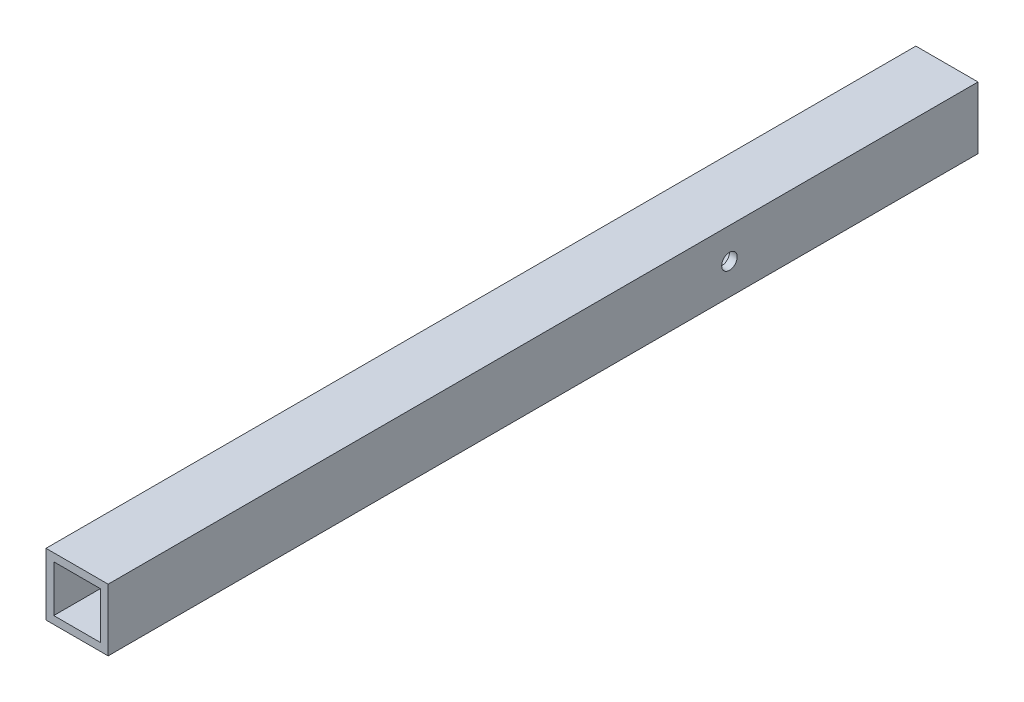
ISO-10303-21;
HEADER;
FILE_DESCRIPTION(('STEP AP214'),'2;1');
FILE_NAME('part.step','',(''),(''),'','','');
FILE_SCHEMA(('AUTOMOTIVE_DESIGN { 1 0 10303 214 1 1 1 1 }'));
ENDSEC;
DATA;
#1=APPLICATION_CONTEXT('core data for automotive mechanical design processes');
#2=APPLICATION_PROTOCOL_DEFINITION('international standard','automotive_design',2000,#1);
#3=PRODUCT_CONTEXT('',#1,'mechanical');
#4=PRODUCT('Part','Part','',(#3));
#5=PRODUCT_RELATED_PRODUCT_CATEGORY('part','',(#4));
#6=PRODUCT_DEFINITION_FORMATION('','',#4);
#7=PRODUCT_DEFINITION_CONTEXT('part definition',#1,'design');
#8=PRODUCT_DEFINITION('design','',#6,#7);
#9=PRODUCT_DEFINITION_SHAPE('','',#8);
#10=(LENGTH_UNIT() NAMED_UNIT(*) SI_UNIT(.MILLI.,.METRE.));
#11=(NAMED_UNIT(*) PLANE_ANGLE_UNIT() SI_UNIT($,.RADIAN.));
#12=(NAMED_UNIT(*) SI_UNIT($,.STERADIAN.) SOLID_ANGLE_UNIT());
#13=UNCERTAINTY_MEASURE_WITH_UNIT(LENGTH_MEASURE(1.E-05),#10,'distance_accuracy_value','');
#14=(GEOMETRIC_REPRESENTATION_CONTEXT(3) GLOBAL_UNCERTAINTY_ASSIGNED_CONTEXT((#13)) GLOBAL_UNIT_ASSIGNED_CONTEXT((#10,
#11,#12)) REPRESENTATION_CONTEXT('',''));
#15=CARTESIAN_POINT('',(0.,0.,0.));
#16=DIRECTION('',(0.,0.,1.));
#17=DIRECTION('',(1.,0.,0.));
#18=AXIS2_PLACEMENT_3D('',#15,#16,#17);
#19=CARTESIAN_POINT('',(0.,0.,355.6));
#20=DIRECTION('',(0.,0.,-1.));
#21=DIRECTION('',(-1.,0.,0.));
#22=AXIS2_PLACEMENT_3D('',#19,#20,#21);
#23=PLANE('',#22);
#24=DIRECTION('',(0.,-1.,0.));
#25=VECTOR('',#24,1.);
#26=CARTESIAN_POINT('',(0.,0.,355.6));
#27=LINE('',#26,#25);
#28=CARTESIAN_POINT('',(0.,25.4,355.6));
#29=VERTEX_POINT('',#28);
#30=CARTESIAN_POINT('',(0.,0.,355.6));
#31=VERTEX_POINT('',#30);
#32=EDGE_CURVE('E156',#29,#31,#27,.T.);
#33=ORIENTED_EDGE('',*,*,#32,.T.);
#34=DIRECTION('',(1.,0.,0.));
#35=VECTOR('',#34,1.);
#36=CARTESIAN_POINT('',(0.,0.,355.6));
#37=LINE('',#36,#35);
#38=CARTESIAN_POINT('',(25.4,0.,355.6));
#39=VERTEX_POINT('',#38);
#40=EDGE_CURVE('E160',#31,#39,#37,.T.);
#41=ORIENTED_EDGE('',*,*,#40,.T.);
#42=DIRECTION('',(0.,1.,0.));
#43=VECTOR('',#42,1.);
#44=CARTESIAN_POINT('',(25.4,0.,355.6));
#45=LINE('',#44,#43);
#46=CARTESIAN_POINT('',(25.4,25.4,355.6));
#47=VERTEX_POINT('',#46);
#48=EDGE_CURVE('E164',#39,#47,#45,.T.);
#49=ORIENTED_EDGE('',*,*,#48,.T.);
#50=DIRECTION('',(-1.,0.,0.));
#51=VECTOR('',#50,1.);
#52=CARTESIAN_POINT('',(0.,25.4,355.6));
#53=LINE('',#52,#51);
#54=EDGE_CURVE('E167',#47,#29,#53,.T.);
#55=ORIENTED_EDGE('',*,*,#54,.T.);
#56=EDGE_LOOP('',(#33,#41,#49,#55));
#57=FACE_BOUND('',#56,.T.);
#58=DIRECTION('',(0.,1.,0.));
#59=VECTOR('',#58,1.);
#60=CARTESIAN_POINT('',(22.225,22.225,355.6));
#61=LINE('',#60,#59);
#62=CARTESIAN_POINT('',(22.225,3.175,355.6));
#63=VERTEX_POINT('',#62);
#64=CARTESIAN_POINT('',(22.225,22.225,355.6));
#65=VERTEX_POINT('',#64);
#66=EDGE_CURVE('E106',#63,#65,#61,.T.);
#67=ORIENTED_EDGE('',*,*,#66,.F.);
#68=DIRECTION('',(1.,0.,0.));
#69=VECTOR('',#68,1.);
#70=CARTESIAN_POINT('',(22.225,3.175,355.6));
#71=LINE('',#70,#69);
#72=CARTESIAN_POINT('',(3.17500000000001,3.175,355.6));
#73=VERTEX_POINT('',#72);
#74=EDGE_CURVE('E132',#73,#63,#71,.T.);
#75=ORIENTED_EDGE('',*,*,#74,.F.);
#76=DIRECTION('',(0.,-1.,0.));
#77=VECTOR('',#76,1.);
#78=CARTESIAN_POINT('',(3.175,22.225,355.6));
#79=LINE('',#78,#77);
#80=CARTESIAN_POINT('',(3.175,22.225,355.6));
#81=VERTEX_POINT('',#80);
#82=EDGE_CURVE('E128',#81,#73,#79,.T.);
#83=ORIENTED_EDGE('',*,*,#82,.F.);
#84=DIRECTION('',(-1.,0.,0.));
#85=VECTOR('',#84,1.);
#86=CARTESIAN_POINT('',(22.225,22.225,355.6));
#87=LINE('',#86,#85);
#88=EDGE_CURVE('E115',#65,#81,#87,.T.);
#89=ORIENTED_EDGE('',*,*,#88,.F.);
#90=EDGE_LOOP('',(#67,#75,#83,#89));
#91=FACE_BOUND('',#90,.T.);
#92=ADVANCED_FACE('F39',(#57,#91),#23,.F.);
#93=CARTESIAN_POINT('',(0.,0.,0.));
#94=DIRECTION('',(0.,0.,-1.));
#95=DIRECTION('',(-1.,0.,0.));
#96=AXIS2_PLACEMENT_3D('',#93,#94,#95);
#97=PLANE('',#96);
#98=DIRECTION('',(0.,-1.,0.));
#99=VECTOR('',#98,1.);
#100=CARTESIAN_POINT('',(0.,0.,0.));
#101=LINE('',#100,#99);
#102=CARTESIAN_POINT('',(0.,25.4,0.));
#103=VERTEX_POINT('',#102);
#104=CARTESIAN_POINT('',(0.,0.,0.));
#105=VERTEX_POINT('',#104);
#106=EDGE_CURVE('E124',#103,#105,#101,.T.);
#107=ORIENTED_EDGE('',*,*,#106,.F.);
#108=DIRECTION('',(-1.,0.,0.));
#109=VECTOR('',#108,1.);
#110=CARTESIAN_POINT('',(0.,25.4,0.));
#111=LINE('',#110,#109);
#112=CARTESIAN_POINT('',(25.4,25.4,0.));
#113=VERTEX_POINT('',#112);
#114=EDGE_CURVE('E161',#113,#103,#111,.T.);
#115=ORIENTED_EDGE('',*,*,#114,.F.);
#116=DIRECTION('',(0.,1.,0.));
#117=VECTOR('',#116,1.);
#118=CARTESIAN_POINT('',(25.4,0.,0.));
#119=LINE('',#118,#117);
#120=CARTESIAN_POINT('',(25.4,0.,0.));
#121=VERTEX_POINT('',#120);
#122=EDGE_CURVE('E177',#121,#113,#119,.T.);
#123=ORIENTED_EDGE('',*,*,#122,.F.);
#124=DIRECTION('',(1.,0.,0.));
#125=VECTOR('',#124,1.);
#126=CARTESIAN_POINT('',(0.,0.,0.));
#127=LINE('',#126,#125);
#128=EDGE_CURVE('E174',#105,#121,#127,.T.);
#129=ORIENTED_EDGE('',*,*,#128,.F.);
#130=EDGE_LOOP('',(#107,#115,#123,#129));
#131=FACE_BOUND('',#130,.T.);
#132=DIRECTION('',(1.,0.,0.));
#133=VECTOR('',#132,1.);
#134=CARTESIAN_POINT('',(22.225,3.175,0.));
#135=LINE('',#134,#133);
#136=CARTESIAN_POINT('',(3.17500000000001,3.175,0.));
#137=VERTEX_POINT('',#136);
#138=CARTESIAN_POINT('',(22.225,3.175,0.));
#139=VERTEX_POINT('',#138);
#140=EDGE_CURVE('E116',#137,#139,#135,.T.);
#141=ORIENTED_EDGE('',*,*,#140,.T.);
#142=DIRECTION('',(0.,1.,0.));
#143=VECTOR('',#142,1.);
#144=CARTESIAN_POINT('',(22.225,22.225,0.));
#145=LINE('',#144,#143);
#146=CARTESIAN_POINT('',(22.225,22.225,0.));
#147=VERTEX_POINT('',#146);
#148=EDGE_CURVE('E64',#139,#147,#145,.T.);
#149=ORIENTED_EDGE('',*,*,#148,.T.);
#150=DIRECTION('',(-1.,0.,0.));
#151=VECTOR('',#150,1.);
#152=CARTESIAN_POINT('',(22.225,22.225,0.));
#153=LINE('',#152,#151);
#154=CARTESIAN_POINT('',(3.175,22.225,0.));
#155=VERTEX_POINT('',#154);
#156=EDGE_CURVE('E122',#147,#155,#153,.T.);
#157=ORIENTED_EDGE('',*,*,#156,.T.);
#158=DIRECTION('',(0.,-1.,0.));
#159=VECTOR('',#158,1.);
#160=CARTESIAN_POINT('',(3.175,22.225,0.));
#161=LINE('',#160,#159);
#162=EDGE_CURVE('E143',#155,#137,#161,.T.);
#163=ORIENTED_EDGE('',*,*,#162,.T.);
#164=EDGE_LOOP('',(#141,#149,#157,#163));
#165=FACE_BOUND('',#164,.T.);
#166=ADVANCED_FACE('F201',(#131,#165),#97,.T.);
#167=CARTESIAN_POINT('',(0.,0.,355.6));
#168=DIRECTION('',(1.,0.,0.));
#169=DIRECTION('',(0.,1.,0.));
#170=AXIS2_PLACEMENT_3D('',#167,#168,#169);
#171=PLANE('',#170);
#172=CARTESIAN_POINT('',(0.,12.7,101.6));
#173=DIRECTION('',(-1.,0.,0.));
#174=DIRECTION('',(0.,-1.,0.));
#175=AXIS2_PLACEMENT_3D('',#172,#173,#174);
#176=CIRCLE('',#175,3.175);
#177=CARTESIAN_POINT('',(0.,9.525,101.6));
#178=VERTEX_POINT('',#177);
#179=EDGE_CURVE('E246',#178,#178,#176,.T.);
#180=ORIENTED_EDGE('',*,*,#179,.F.);
#181=EDGE_LOOP('',(#180));
#182=FACE_BOUND('',#181,.T.);
#183=ORIENTED_EDGE('',*,*,#106,.T.);
#184=DIRECTION('',(0.,0.,-1.));
#185=VECTOR('',#184,1.);
#186=CARTESIAN_POINT('',(0.,0.,355.6));
#187=LINE('',#186,#185);
#188=EDGE_CURVE('E11',#31,#105,#187,.T.);
#189=ORIENTED_EDGE('',*,*,#188,.F.);
#190=ORIENTED_EDGE('',*,*,#32,.F.);
#191=DIRECTION('',(0.,0.,-1.));
#192=VECTOR('',#191,1.);
#193=CARTESIAN_POINT('',(0.,25.4,355.6));
#194=LINE('',#193,#192);
#195=EDGE_CURVE('E170',#29,#103,#194,.T.);
#196=ORIENTED_EDGE('',*,*,#195,.T.);
#197=EDGE_LOOP('',(#183,#189,#190,#196));
#198=FACE_BOUND('',#197,.T.);
#199=ADVANCED_FACE('F41',(#182,#198),#171,.F.);
#200=CARTESIAN_POINT('',(0.,0.,355.6));
#201=DIRECTION('',(0.,1.,0.));
#202=DIRECTION('',(0.,0.,1.));
#203=AXIS2_PLACEMENT_3D('',#200,#201,#202);
#204=PLANE('',#203);
#205=ORIENTED_EDGE('',*,*,#128,.T.);
#206=DIRECTION('',(0.,0.,-1.));
#207=VECTOR('',#206,1.);
#208=CARTESIAN_POINT('',(25.4,0.,355.6));
#209=LINE('',#208,#207);
#210=EDGE_CURVE('E49',#39,#121,#209,.T.);
#211=ORIENTED_EDGE('',*,*,#210,.F.);
#212=ORIENTED_EDGE('',*,*,#40,.F.);
#213=ORIENTED_EDGE('',*,*,#188,.T.);
#214=EDGE_LOOP('',(#205,#211,#212,#213));
#215=FACE_BOUND('',#214,.T.);
#216=ADVANCED_FACE('F211',(#215),#204,.F.);
#217=CARTESIAN_POINT('',(25.4,0.,355.6));
#218=DIRECTION('',(-1.,0.,0.));
#219=DIRECTION('',(0.,-1.,0.));
#220=AXIS2_PLACEMENT_3D('',#217,#218,#219);
#221=PLANE('',#220);
#222=CARTESIAN_POINT('',(25.4,12.7,101.6));
#223=DIRECTION('',(-1.,0.,0.));
#224=DIRECTION('',(0.,-1.,0.));
#225=AXIS2_PLACEMENT_3D('',#222,#223,#224);
#226=CIRCLE('',#225,3.175);
#227=CARTESIAN_POINT('',(25.4,9.52500000000001,101.6));
#228=VERTEX_POINT('',#227);
#229=EDGE_CURVE('E244',#228,#228,#226,.T.);
#230=ORIENTED_EDGE('',*,*,#229,.T.);
#231=EDGE_LOOP('',(#230));
#232=FACE_BOUND('',#231,.T.);
#233=ORIENTED_EDGE('',*,*,#122,.T.);
#234=DIRECTION('',(0.,0.,-1.));
#235=VECTOR('',#234,1.);
#236=CARTESIAN_POINT('',(25.4,25.4,355.6));
#237=LINE('',#236,#235);
#238=EDGE_CURVE('E185',#47,#113,#237,.T.);
#239=ORIENTED_EDGE('',*,*,#238,.F.);
#240=ORIENTED_EDGE('',*,*,#48,.F.);
#241=ORIENTED_EDGE('',*,*,#210,.T.);
#242=EDGE_LOOP('',(#233,#239,#240,#241));
#243=FACE_BOUND('',#242,.T.);
#244=ADVANCED_FACE('F195',(#232,#243),#221,.F.);
#245=CARTESIAN_POINT('',(0.,25.4,355.6));
#246=DIRECTION('',(0.,-1.,0.));
#247=DIRECTION('',(0.,0.,-1.));
#248=AXIS2_PLACEMENT_3D('',#245,#246,#247);
#249=PLANE('',#248);
#250=ORIENTED_EDGE('',*,*,#114,.T.);
#251=ORIENTED_EDGE('',*,*,#195,.F.);
#252=ORIENTED_EDGE('',*,*,#54,.F.);
#253=ORIENTED_EDGE('',*,*,#238,.T.);
#254=EDGE_LOOP('',(#250,#251,#252,#253));
#255=FACE_BOUND('',#254,.T.);
#256=ADVANCED_FACE('F205',(#255),#249,.F.);
#257=CARTESIAN_POINT('',(22.225,22.225,355.6));
#258=DIRECTION('',(-1.,0.,0.));
#259=DIRECTION('',(0.,-1.,0.));
#260=AXIS2_PLACEMENT_3D('',#257,#258,#259);
#261=PLANE('',#260);
#262=CARTESIAN_POINT('',(22.225,12.7,101.6));
#263=DIRECTION('',(-1.,0.,0.));
#264=DIRECTION('',(0.,-1.,0.));
#265=AXIS2_PLACEMENT_3D('',#262,#263,#264);
#266=CIRCLE('',#265,3.175);
#267=CARTESIAN_POINT('',(22.225,9.52500000000001,101.6));
#268=VERTEX_POINT('',#267);
#269=EDGE_CURVE('E140',#268,#268,#266,.T.);
#270=ORIENTED_EDGE('',*,*,#269,.F.);
#271=EDGE_LOOP('',(#270));
#272=FACE_BOUND('',#271,.T.);
#273=ORIENTED_EDGE('',*,*,#148,.F.);
#274=DIRECTION('',(0.,0.,-1.));
#275=VECTOR('',#274,1.);
#276=CARTESIAN_POINT('',(22.225,3.175,355.6));
#277=LINE('',#276,#275);
#278=EDGE_CURVE('E110',#63,#139,#277,.T.);
#279=ORIENTED_EDGE('',*,*,#278,.F.);
#280=ORIENTED_EDGE('',*,*,#66,.T.);
#281=DIRECTION('',(0.,0.,-1.));
#282=VECTOR('',#281,1.);
#283=CARTESIAN_POINT('',(22.225,22.225,355.6));
#284=LINE('',#283,#282);
#285=EDGE_CURVE('E109',#65,#147,#284,.T.);
#286=ORIENTED_EDGE('',*,*,#285,.T.);
#287=EDGE_LOOP('',(#273,#279,#280,#286));
#288=FACE_BOUND('',#287,.T.);
#289=ADVANCED_FACE('F108',(#272,#288),#261,.T.);
#290=CARTESIAN_POINT('',(22.225,22.225,355.6));
#291=DIRECTION('',(0.,-1.,0.));
#292=DIRECTION('',(1.,0.,0.));
#293=AXIS2_PLACEMENT_3D('',#290,#291,#292);
#294=PLANE('',#293);
#295=ORIENTED_EDGE('',*,*,#156,.F.);
#296=ORIENTED_EDGE('',*,*,#285,.F.);
#297=ORIENTED_EDGE('',*,*,#88,.T.);
#298=DIRECTION('',(0.,0.,-1.));
#299=VECTOR('',#298,1.);
#300=CARTESIAN_POINT('',(3.175,22.225,355.6));
#301=LINE('',#300,#299);
#302=EDGE_CURVE('E125',#81,#155,#301,.T.);
#303=ORIENTED_EDGE('',*,*,#302,.T.);
#304=EDGE_LOOP('',(#295,#296,#297,#303));
#305=FACE_BOUND('',#304,.T.);
#306=ADVANCED_FACE('F119',(#305),#294,.T.);
#307=CARTESIAN_POINT('',(3.175,22.225,355.6));
#308=DIRECTION('',(1.,0.,0.));
#309=DIRECTION('',(0.,1.,0.));
#310=AXIS2_PLACEMENT_3D('',#307,#308,#309);
#311=PLANE('',#310);
#312=CARTESIAN_POINT('',(3.175,12.7,101.6));
#313=DIRECTION('',(1.,0.,0.));
#314=DIRECTION('',(0.,1.,0.));
#315=AXIS2_PLACEMENT_3D('',#312,#313,#314);
#316=CIRCLE('',#315,3.175);
#317=CARTESIAN_POINT('',(3.175,15.875,101.6));
#318=VERTEX_POINT('',#317);
#319=EDGE_CURVE('E43',#318,#318,#316,.T.);
#320=ORIENTED_EDGE('',*,*,#319,.F.);
#321=EDGE_LOOP('',(#320));
#322=FACE_BOUND('',#321,.T.);
#323=ORIENTED_EDGE('',*,*,#162,.F.);
#324=ORIENTED_EDGE('',*,*,#302,.F.);
#325=ORIENTED_EDGE('',*,*,#82,.T.);
#326=DIRECTION('',(0.,0.,-1.));
#327=VECTOR('',#326,1.);
#328=CARTESIAN_POINT('',(3.17500000000001,3.175,355.6));
#329=LINE('',#328,#327);
#330=EDGE_CURVE('E56',#73,#137,#329,.T.);
#331=ORIENTED_EDGE('',*,*,#330,.T.);
#332=EDGE_LOOP('',(#323,#324,#325,#331));
#333=FACE_BOUND('',#332,.T.);
#334=ADVANCED_FACE('F237',(#322,#333),#311,.T.);
#335=CARTESIAN_POINT('',(22.225,3.175,355.6));
#336=DIRECTION('',(0.,1.,0.));
#337=DIRECTION('',(-1.,0.,0.));
#338=AXIS2_PLACEMENT_3D('',#335,#336,#337);
#339=PLANE('',#338);
#340=ORIENTED_EDGE('',*,*,#140,.F.);
#341=ORIENTED_EDGE('',*,*,#330,.F.);
#342=ORIENTED_EDGE('',*,*,#74,.T.);
#343=ORIENTED_EDGE('',*,*,#278,.T.);
#344=EDGE_LOOP('',(#340,#341,#342,#343));
#345=FACE_BOUND('',#344,.T.);
#346=ADVANCED_FACE('F261',(#345),#339,.T.);
#347=CARTESIAN_POINT('',(25.4,12.7,101.6));
#348=DIRECTION('',(-1.,0.,0.));
#349=DIRECTION('',(0.,-1.,0.));
#350=AXIS2_PLACEMENT_3D('',#347,#348,#349);
#351=CYLINDRICAL_SURFACE('',#350,3.175);
#352=ORIENTED_EDGE('',*,*,#319,.T.);
#353=EDGE_LOOP('',(#352));
#354=FACE_BOUND('',#353,.T.);
#355=ORIENTED_EDGE('',*,*,#179,.T.);
#356=EDGE_LOOP('',(#355));
#357=FACE_BOUND('',#356,.T.);
#358=ADVANCED_FACE('F256',(#354,#357),#351,.F.);
#359=ORIENTED_EDGE('',*,*,#269,.T.);
#360=EDGE_LOOP('',(#359));
#361=FACE_BOUND('',#360,.T.);
#362=ORIENTED_EDGE('',*,*,#229,.F.);
#363=EDGE_LOOP('',(#362));
#364=FACE_BOUND('',#363,.T.);
#365=ADVANCED_FACE('F254',(#361,#364),#351,.F.);
#366=CLOSED_SHELL('',(#92,#166,#199,#216,#244,#256,#289,#306,#334,#346,#358,#365));
#367=MANIFOLD_SOLID_BREP('B2',#366);
#368=ADVANCED_BREP_SHAPE_REPRESENTATION('',(#18,#367),#14);
#369=SHAPE_DEFINITION_REPRESENTATION(#9,#368);
ENDSEC;
END-ISO-10303-21;
